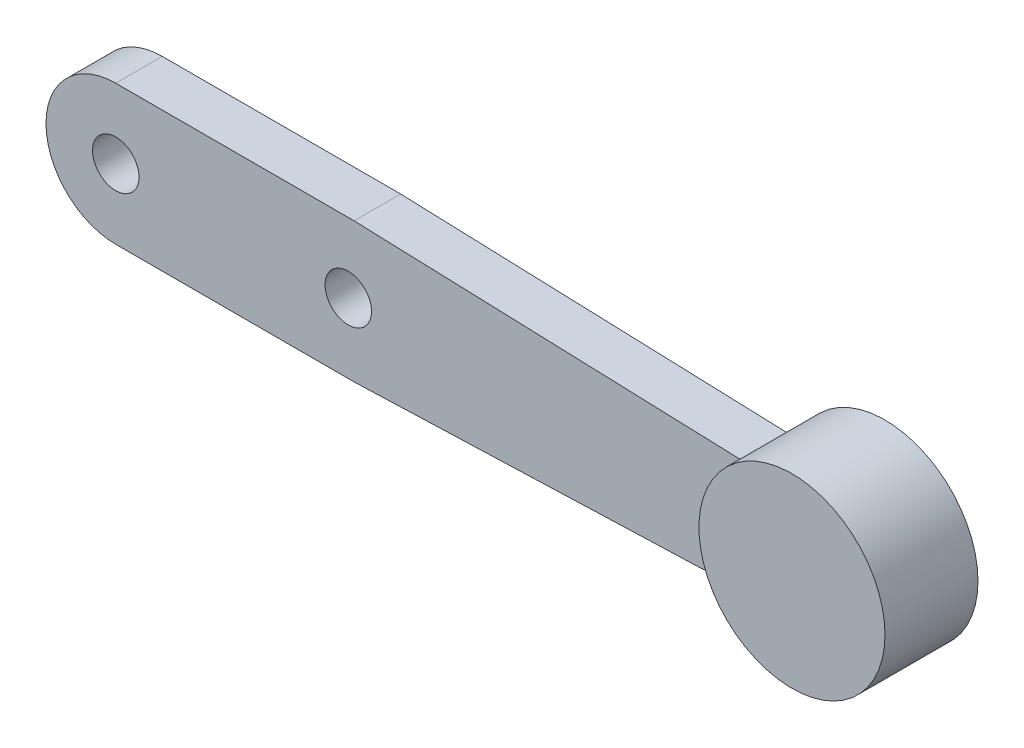
ISO-10303-21;
HEADER;
FILE_DESCRIPTION(('STEP AP214'),'2;1');
FILE_NAME('part.step','',(''),(''),'','','');
FILE_SCHEMA(('AUTOMOTIVE_DESIGN { 1 0 10303 214 1 1 1 1 }'));
ENDSEC;
DATA;
#1=APPLICATION_CONTEXT('core data for automotive mechanical design processes');
#2=APPLICATION_PROTOCOL_DEFINITION('international standard','automotive_design',2000,#1);
#3=PRODUCT_CONTEXT('',#1,'mechanical');
#4=PRODUCT('Part','Part','',(#3));
#5=PRODUCT_RELATED_PRODUCT_CATEGORY('part','',(#4));
#6=PRODUCT_DEFINITION_FORMATION('','',#4);
#7=PRODUCT_DEFINITION_CONTEXT('part definition',#1,'design');
#8=PRODUCT_DEFINITION('design','',#6,#7);
#9=PRODUCT_DEFINITION_SHAPE('','',#8);
#10=(LENGTH_UNIT() NAMED_UNIT(*) SI_UNIT(.MILLI.,.METRE.));
#11=(NAMED_UNIT(*) PLANE_ANGLE_UNIT() SI_UNIT($,.RADIAN.));
#12=(NAMED_UNIT(*) SI_UNIT($,.STERADIAN.) SOLID_ANGLE_UNIT());
#13=UNCERTAINTY_MEASURE_WITH_UNIT(LENGTH_MEASURE(1.E-05),#10,'distance_accuracy_value','');
#14=(GEOMETRIC_REPRESENTATION_CONTEXT(3) GLOBAL_UNCERTAINTY_ASSIGNED_CONTEXT((#13)) GLOBAL_UNIT_ASSIGNED_CONTEXT((#10,
#11,#12)) REPRESENTATION_CONTEXT('',''));
#15=CARTESIAN_POINT('',(0.,0.,0.));
#16=DIRECTION('',(0.,0.,1.));
#17=DIRECTION('',(1.,0.,0.));
#18=AXIS2_PLACEMENT_3D('',#15,#16,#17);
#19=CARTESIAN_POINT('',(0.26215149831417,-7.50703670422191,2.5));
#20=DIRECTION('',(-0.0348994967024939,0.999390827019096,0.));
#21=DIRECTION('',(-0.999390827019096,-0.0348994967024939,0.));
#22=AXIS2_PLACEMENT_3D('',#19,#20,#21);
#23=PLANE('',#22);
#24=DIRECTION('',(0.,0.,-1.));
#25=VECTOR('',#24,1.);
#26=CARTESIAN_POINT('',(42.2370114472895,-6.04124229549565,5.));
#27=LINE('',#26,#25);
#28=CARTESIAN_POINT('',(42.2370114472895,-6.04124229549565,2.5));
#29=VERTEX_POINT('',#28);
#30=CARTESIAN_POINT('',(42.2370114472895,-6.04124229549565,-2.5));
#31=VERTEX_POINT('',#30);
#32=EDGE_CURVE('E58',#29,#31,#27,.T.);
#33=ORIENTED_EDGE('',*,*,#32,.F.);
#34=DIRECTION('',(0.999390827019096,0.0348994967024939,0.));
#35=VECTOR('',#34,1.);
#36=CARTESIAN_POINT('',(0.26215149831417,-7.50703670422191,2.5));
#37=LINE('',#36,#35);
#38=CARTESIAN_POINT('',(0.631823856045043,-7.49412746103012,2.5));
#39=VERTEX_POINT('',#38);
#40=EDGE_CURVE('E124',#39,#29,#37,.T.);
#41=ORIENTED_EDGE('',*,*,#40,.F.);
#42=DIRECTION('',(0.,0.,-1.));
#43=VECTOR('',#42,1.);
#44=CARTESIAN_POINT('',(0.631823856045043,-7.49412746103012,2.5));
#45=LINE('',#44,#43);
#46=CARTESIAN_POINT('',(0.631823856045043,-7.49412746103012,-2.5));
#47=VERTEX_POINT('',#46);
#48=EDGE_CURVE('E149',#39,#47,#45,.T.);
#49=ORIENTED_EDGE('',*,*,#48,.T.);
#50=DIRECTION('',(0.999390827019096,0.0348994967024939,0.));
#51=VECTOR('',#50,1.);
#52=CARTESIAN_POINT('',(0.26215149831417,-7.50703670422191,-2.5));
#53=LINE('',#52,#51);
#54=EDGE_CURVE('E99',#47,#31,#53,.T.);
#55=ORIENTED_EDGE('',*,*,#54,.T.);
#56=EDGE_LOOP('',(#33,#41,#49,#55));
#57=FACE_BOUND('',#56,.T.);
#58=ADVANCED_FACE('F35',(#57),#23,.F.);
#59=CARTESIAN_POINT('',(0.262561145924633,7.51876747695188,2.5));
#60=DIRECTION('',(0.0348994967024939,0.999390827019096,0.));
#61=DIRECTION('',(-0.999390827019096,0.0348994967024939,0.));
#62=AXIS2_PLACEMENT_3D('',#59,#60,#61);
#63=PLANE('',#62);
#64=DIRECTION('',(0.999390827019096,-0.0348994967024939,0.));
#65=VECTOR('',#64,1.);
#66=CARTESIAN_POINT('',(0.262561145924633,7.51876747695188,2.5));
#67=LINE('',#66,#65);
#68=CARTESIAN_POINT('',(0.631823856045043,7.50587253896987,2.5));
#69=VERTEX_POINT('',#68);
#70=CARTESIAN_POINT('',(42.2370114472895,6.05298737343539,2.5));
#71=VERTEX_POINT('',#70);
#72=EDGE_CURVE('E104',#69,#71,#67,.T.);
#73=ORIENTED_EDGE('',*,*,#72,.T.);
#74=DIRECTION('',(0.,0.,-1.));
#75=VECTOR('',#74,1.);
#76=CARTESIAN_POINT('',(42.2370114472895,6.0529873734354,5.));
#77=LINE('',#76,#75);
#78=CARTESIAN_POINT('',(42.2370114472895,6.05298737343539,-2.5));
#79=VERTEX_POINT('',#78);
#80=EDGE_CURVE('E102',#71,#79,#77,.T.);
#81=ORIENTED_EDGE('',*,*,#80,.T.);
#82=DIRECTION('',(0.999390827019096,-0.0348994967024939,0.));
#83=VECTOR('',#82,1.);
#84=CARTESIAN_POINT('',(0.262561145924633,7.51876747695188,-2.5));
#85=LINE('',#84,#83);
#86=CARTESIAN_POINT('',(0.631823856045043,7.50587253896987,-2.5));
#87=VERTEX_POINT('',#86);
#88=EDGE_CURVE('E91',#87,#79,#85,.T.);
#89=ORIENTED_EDGE('',*,*,#88,.F.);
#90=DIRECTION('',(0.,0.,-1.));
#91=VECTOR('',#90,1.);
#92=CARTESIAN_POINT('',(0.631823856045043,7.50587253896987,2.5));
#93=LINE('',#92,#91);
#94=EDGE_CURVE('E147',#69,#87,#93,.T.);
#95=ORIENTED_EDGE('',*,*,#94,.F.);
#96=EDGE_LOOP('',(#73,#81,#89,#95));
#97=FACE_BOUND('',#96,.T.);
#98=ADVANCED_FACE('F103',(#97),#63,.T.);
#99=CARTESIAN_POINT('',(-25.,0.00587253896988193,2.5));
#100=DIRECTION('',(0.,0.,-1.));
#101=DIRECTION('',(-1.,0.,0.));
#102=AXIS2_PLACEMENT_3D('',#99,#100,#101);
#103=CYLINDRICAL_SURFACE('',#102,7.5);
#104=CARTESIAN_POINT('',(-25.,0.00587253896988193,-2.5));
#105=DIRECTION('',(0.,0.,1.));
#106=DIRECTION('',(1.,0.,0.));
#107=AXIS2_PLACEMENT_3D('',#104,#105,#106);
#108=CIRCLE('',#107,7.5);
#109=CARTESIAN_POINT('',(-25.,7.50587253896988,-2.5));
#110=VERTEX_POINT('',#109);
#111=CARTESIAN_POINT('',(-25.,-7.49412746103012,-2.5));
#112=VERTEX_POINT('',#111);
#113=EDGE_CURVE('E135',#110,#112,#108,.T.);
#114=ORIENTED_EDGE('',*,*,#113,.T.);
#115=DIRECTION('',(0.,0.,-1.));
#116=VECTOR('',#115,1.);
#117=CARTESIAN_POINT('',(-25.,-7.49412746103012,2.5));
#118=LINE('',#117,#116);
#119=CARTESIAN_POINT('',(-25.,-7.49412746103012,2.5));
#120=VERTEX_POINT('',#119);
#121=EDGE_CURVE('E43',#120,#112,#118,.T.);
#122=ORIENTED_EDGE('',*,*,#121,.F.);
#123=CARTESIAN_POINT('',(-25.,0.00587253896988193,2.5));
#124=DIRECTION('',(0.,0.,1.));
#125=DIRECTION('',(1.,0.,0.));
#126=AXIS2_PLACEMENT_3D('',#123,#124,#125);
#127=CIRCLE('',#126,7.5);
#128=CARTESIAN_POINT('',(-25.,7.50587253896988,2.5));
#129=VERTEX_POINT('',#128);
#130=EDGE_CURVE('E118',#129,#120,#127,.T.);
#131=ORIENTED_EDGE('',*,*,#130,.F.);
#132=DIRECTION('',(0.,0.,-1.));
#133=VECTOR('',#132,1.);
#134=CARTESIAN_POINT('',(-25.,7.50587253896988,2.5));
#135=LINE('',#134,#133);
#136=EDGE_CURVE('E132',#129,#110,#135,.T.);
#137=ORIENTED_EDGE('',*,*,#136,.T.);
#138=EDGE_LOOP('',(#114,#122,#131,#137));
#139=FACE_BOUND('',#138,.T.);
#140=ADVANCED_FACE('F157',(#139),#103,.T.);
#141=CARTESIAN_POINT('',(0.,-7.49412746103012,2.5));
#142=DIRECTION('',(0.,-1.,0.));
#143=DIRECTION('',(1.,0.,0.));
#144=AXIS2_PLACEMENT_3D('',#141,#142,#143);
#145=PLANE('',#144);
#146=DIRECTION('',(-1.,0.,0.));
#147=VECTOR('',#146,1.);
#148=CARTESIAN_POINT('',(0.,-7.49412746103012,-2.5));
#149=LINE('',#148,#147);
#150=EDGE_CURVE('E138',#47,#112,#149,.T.);
#151=ORIENTED_EDGE('',*,*,#150,.F.);
#152=ORIENTED_EDGE('',*,*,#48,.F.);
#153=DIRECTION('',(-1.,0.,0.));
#154=VECTOR('',#153,1.);
#155=CARTESIAN_POINT('',(0.,-7.49412746103012,2.5));
#156=LINE('',#155,#154);
#157=EDGE_CURVE('E121',#39,#120,#156,.T.);
#158=ORIENTED_EDGE('',*,*,#157,.T.);
#159=ORIENTED_EDGE('',*,*,#121,.T.);
#160=EDGE_LOOP('',(#151,#152,#158,#159));
#161=FACE_BOUND('',#160,.T.);
#162=ADVANCED_FACE('F153',(#161),#145,.T.);
#163=CARTESIAN_POINT('',(0.,7.50587253896987,2.5));
#164=DIRECTION('',(0.,-1.,0.));
#165=DIRECTION('',(1.,0.,0.));
#166=AXIS2_PLACEMENT_3D('',#163,#164,#165);
#167=PLANE('',#166);
#168=DIRECTION('',(-1.,0.,0.));
#169=VECTOR('',#168,1.);
#170=CARTESIAN_POINT('',(0.,7.50587253896987,-2.5));
#171=LINE('',#170,#169);
#172=EDGE_CURVE('E97',#87,#110,#171,.T.);
#173=ORIENTED_EDGE('',*,*,#172,.T.);
#174=ORIENTED_EDGE('',*,*,#136,.F.);
#175=DIRECTION('',(-1.,0.,0.));
#176=VECTOR('',#175,1.);
#177=CARTESIAN_POINT('',(0.,7.50587253896987,2.5));
#178=LINE('',#177,#176);
#179=EDGE_CURVE('E127',#69,#129,#178,.T.);
#180=ORIENTED_EDGE('',*,*,#179,.F.);
#181=ORIENTED_EDGE('',*,*,#94,.T.);
#182=EDGE_LOOP('',(#173,#174,#180,#181));
#183=FACE_BOUND('',#182,.T.);
#184=ADVANCED_FACE('F163',(#183),#167,.F.);
#185=CARTESIAN_POINT('',(0.,0.,2.5));
#186=DIRECTION('',(0.,0.,-1.));
#187=DIRECTION('',(-1.,0.,0.));
#188=AXIS2_PLACEMENT_3D('',#185,#186,#187);
#189=CYLINDRICAL_SURFACE('',#188,2.5);
#190=CARTESIAN_POINT('',(0.,0.,2.5));
#191=DIRECTION('',(0.,0.,1.));
#192=DIRECTION('',(1.,0.,0.));
#193=AXIS2_PLACEMENT_3D('',#190,#191,#192);
#194=CIRCLE('',#193,2.5);
#195=CARTESIAN_POINT('',(2.5,0.,2.5));
#196=VERTEX_POINT('',#195);
#197=EDGE_CURVE('E115',#196,#196,#194,.T.);
#198=ORIENTED_EDGE('',*,*,#197,.T.);
#199=EDGE_LOOP('',(#198));
#200=FACE_BOUND('',#199,.T.);
#201=CARTESIAN_POINT('',(0.,0.,-2.5));
#202=DIRECTION('',(0.,0.,1.));
#203=DIRECTION('',(1.,0.,0.));
#204=AXIS2_PLACEMENT_3D('',#201,#202,#203);
#205=CIRCLE('',#204,2.5);
#206=CARTESIAN_POINT('',(2.5,0.,-2.5));
#207=VERTEX_POINT('',#206);
#208=EDGE_CURVE('E111',#207,#207,#205,.T.);
#209=ORIENTED_EDGE('',*,*,#208,.F.);
#210=EDGE_LOOP('',(#209));
#211=FACE_BOUND('',#210,.T.);
#212=ADVANCED_FACE('F37',(#200,#211),#189,.F.);
#213=CARTESIAN_POINT('',(-25.,0.00587253896988193,2.5));
#214=DIRECTION('',(0.,0.,-1.));
#215=DIRECTION('',(-1.,0.,0.));
#216=AXIS2_PLACEMENT_3D('',#213,#214,#215);
#217=CYLINDRICAL_SURFACE('',#216,2.5);
#218=CARTESIAN_POINT('',(-25.,0.00587253896988193,2.5));
#219=DIRECTION('',(0.,0.,1.));
#220=DIRECTION('',(1.,0.,0.));
#221=AXIS2_PLACEMENT_3D('',#218,#219,#220);
#222=CIRCLE('',#221,2.5);
#223=CARTESIAN_POINT('',(-22.5,0.00587253896988193,2.5));
#224=VERTEX_POINT('',#223);
#225=EDGE_CURVE('E129',#224,#224,#222,.T.);
#226=ORIENTED_EDGE('',*,*,#225,.T.);
#227=EDGE_LOOP('',(#226));
#228=FACE_BOUND('',#227,.T.);
#229=CARTESIAN_POINT('',(-25.,0.00587253896988193,-2.5));
#230=DIRECTION('',(0.,0.,1.));
#231=DIRECTION('',(1.,0.,0.));
#232=AXIS2_PLACEMENT_3D('',#229,#230,#231);
#233=CIRCLE('',#232,2.5);
#234=CARTESIAN_POINT('',(-22.5,0.00587253896988193,-2.5));
#235=VERTEX_POINT('',#234);
#236=EDGE_CURVE('E119',#235,#235,#233,.T.);
#237=ORIENTED_EDGE('',*,*,#236,.F.);
#238=EDGE_LOOP('',(#237));
#239=FACE_BOUND('',#238,.T.);
#240=ADVANCED_FACE('F170',(#228,#239),#217,.F.);
#241=CARTESIAN_POINT('',(0.,0.,2.5));
#242=DIRECTION('',(0.,0.,1.));
#243=DIRECTION('',(1.,0.,0.));
#244=AXIS2_PLACEMENT_3D('',#241,#242,#243);
#245=PLANE('',#244);
#246=ORIENTED_EDGE('',*,*,#197,.F.);
#247=EDGE_LOOP('',(#246));
#248=FACE_BOUND('',#247,.T.);
#249=ORIENTED_EDGE('',*,*,#40,.T.);
#250=CARTESIAN_POINT('',(50.2014575786151,0.00587253896987099,2.5));
#251=DIRECTION('',(0.,0.,1.));
#252=DIRECTION('',(1.,0.,0.));
#253=AXIS2_PLACEMENT_3D('',#250,#251,#252);
#254=CIRCLE('',#253,10.);
#255=EDGE_CURVE('E50',#29,#71,#254,.F.);
#256=ORIENTED_EDGE('',*,*,#255,.T.);
#257=ORIENTED_EDGE('',*,*,#72,.F.);
#258=ORIENTED_EDGE('',*,*,#179,.T.);
#259=ORIENTED_EDGE('',*,*,#130,.T.);
#260=ORIENTED_EDGE('',*,*,#157,.F.);
#261=EDGE_LOOP('',(#249,#256,#257,#258,#259,#260));
#262=FACE_BOUND('',#261,.T.);
#263=ORIENTED_EDGE('',*,*,#225,.F.);
#264=EDGE_LOOP('',(#263));
#265=FACE_BOUND('',#264,.T.);
#266=ADVANCED_FACE('F159',(#248,#262,#265),#245,.T.);
#267=CARTESIAN_POINT('',(0.,0.,-2.5));
#268=DIRECTION('',(0.,0.,1.));
#269=DIRECTION('',(1.,0.,0.));
#270=AXIS2_PLACEMENT_3D('',#267,#268,#269);
#271=PLANE('',#270);
#272=CARTESIAN_POINT('',(50.2014575786151,0.00587253896987099,-2.5));
#273=DIRECTION('',(0.,0.,1.));
#274=DIRECTION('',(1.,0.,0.));
#275=AXIS2_PLACEMENT_3D('',#272,#273,#274);
#276=CIRCLE('',#275,10.);
#277=EDGE_CURVE('E11',#31,#79,#276,.F.);
#278=ORIENTED_EDGE('',*,*,#277,.F.);
#279=ORIENTED_EDGE('',*,*,#54,.F.);
#280=ORIENTED_EDGE('',*,*,#150,.T.);
#281=ORIENTED_EDGE('',*,*,#113,.F.);
#282=ORIENTED_EDGE('',*,*,#172,.F.);
#283=ORIENTED_EDGE('',*,*,#88,.T.);
#284=EDGE_LOOP('',(#278,#279,#280,#281,#282,#283));
#285=FACE_BOUND('',#284,.T.);
#286=ORIENTED_EDGE('',*,*,#208,.T.);
#287=EDGE_LOOP('',(#286));
#288=FACE_BOUND('',#287,.T.);
#289=ORIENTED_EDGE('',*,*,#236,.T.);
#290=EDGE_LOOP('',(#289));
#291=FACE_BOUND('',#290,.T.);
#292=ADVANCED_FACE('F93',(#285,#288,#291),#271,.F.);
#293=CARTESIAN_POINT('',(50.2014575786151,0.00587253896987099,5.));
#294=DIRECTION('',(0.,0.,-1.));
#295=DIRECTION('',(-1.,0.,0.));
#296=AXIS2_PLACEMENT_3D('',#293,#294,#295);
#297=CYLINDRICAL_SURFACE('',#296,10.);
#298=ORIENTED_EDGE('',*,*,#255,.F.);
#299=ORIENTED_EDGE('',*,*,#32,.T.);
#300=ORIENTED_EDGE('',*,*,#277,.T.);
#301=ORIENTED_EDGE('',*,*,#80,.F.);
#302=EDGE_LOOP('',(#298,#299,#300,#301));
#303=FACE_BOUND('',#302,.T.);
#304=CARTESIAN_POINT('',(50.2014575786151,0.00587253896987099,5.));
#305=DIRECTION('',(0.,0.,1.));
#306=DIRECTION('',(1.,0.,0.));
#307=AXIS2_PLACEMENT_3D('',#304,#305,#306);
#308=CIRCLE('',#307,10.);
#309=CARTESIAN_POINT('',(60.2014575786151,0.00587253896987099,5.));
#310=VERTEX_POINT('',#309);
#311=EDGE_CURVE('E106',#310,#310,#308,.T.);
#312=ORIENTED_EDGE('',*,*,#311,.F.);
#313=EDGE_LOOP('',(#312));
#314=FACE_BOUND('',#313,.T.);
#315=CARTESIAN_POINT('',(50.2014575786151,0.00587253896987099,-5.));
#316=DIRECTION('',(0.,0.,1.));
#317=DIRECTION('',(1.,0.,0.));
#318=AXIS2_PLACEMENT_3D('',#315,#316,#317);
#319=CIRCLE('',#318,10.);
#320=CARTESIAN_POINT('',(60.2014575786151,0.00587253896987099,-5.));
#321=VERTEX_POINT('',#320);
#322=EDGE_CURVE('E270',#321,#321,#319,.T.);
#323=ORIENTED_EDGE('',*,*,#322,.T.);
#324=EDGE_LOOP('',(#323));
#325=FACE_BOUND('',#324,.T.);
#326=ADVANCED_FACE('F108',(#303,#314,#325),#297,.T.);
#327=CARTESIAN_POINT('',(50.2014575786151,0.00587253896987099,5.));
#328=DIRECTION('',(0.,0.,1.));
#329=DIRECTION('',(1.,0.,0.));
#330=AXIS2_PLACEMENT_3D('',#327,#328,#329);
#331=PLANE('',#330);
#332=ORIENTED_EDGE('',*,*,#311,.T.);
#333=EDGE_LOOP('',(#332));
#334=FACE_BOUND('',#333,.T.);
#335=ADVANCED_FACE('F245',(#334),#331,.T.);
#336=CARTESIAN_POINT('',(50.2014575786151,0.00587253896987099,-5.));
#337=DIRECTION('',(0.,0.,1.));
#338=DIRECTION('',(1.,0.,0.));
#339=AXIS2_PLACEMENT_3D('',#336,#337,#338);
#340=PLANE('',#339);
#341=ORIENTED_EDGE('',*,*,#322,.F.);
#342=EDGE_LOOP('',(#341));
#343=FACE_BOUND('',#342,.T.);
#344=ADVANCED_FACE('F254',(#343),#340,.F.);
#345=CLOSED_SHELL('',(#58,#98,#140,#162,#184,#212,#240,#266,#292,#326,#335,#344));
#346=MANIFOLD_SOLID_BREP('B2',#345);
#347=ADVANCED_BREP_SHAPE_REPRESENTATION('',(#18,#346),#14);
#348=SHAPE_DEFINITION_REPRESENTATION(#9,#347);
ENDSEC;
END-ISO-10303-21;
